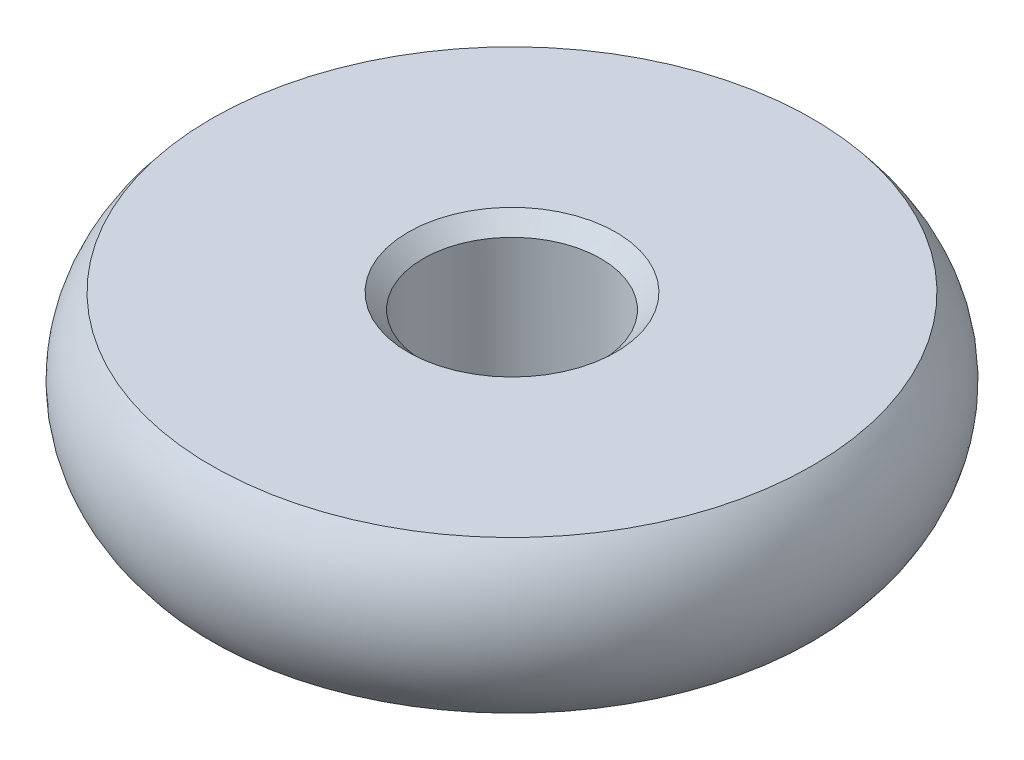
ISO-10303-21;
HEADER;
FILE_DESCRIPTION(('STEP AP214'),'2;1');
FILE_NAME('part.step','',(''),(''),'','','');
FILE_SCHEMA(('AUTOMOTIVE_DESIGN { 1 0 10303 214 1 1 1 1 }'));
ENDSEC;
DATA;
#1=APPLICATION_CONTEXT('core data for automotive mechanical design processes');
#2=APPLICATION_PROTOCOL_DEFINITION('international standard','automotive_design',2000,#1);
#3=PRODUCT_CONTEXT('',#1,'mechanical');
#4=PRODUCT('Part','Part','',(#3));
#5=PRODUCT_RELATED_PRODUCT_CATEGORY('part','',(#4));
#6=PRODUCT_DEFINITION_FORMATION('','',#4);
#7=PRODUCT_DEFINITION_CONTEXT('part definition',#1,'design');
#8=PRODUCT_DEFINITION('design','',#6,#7);
#9=PRODUCT_DEFINITION_SHAPE('','',#8);
#10=(LENGTH_UNIT() NAMED_UNIT(*) SI_UNIT(.MILLI.,.METRE.));
#11=(NAMED_UNIT(*) PLANE_ANGLE_UNIT() SI_UNIT($,.RADIAN.));
#12=(NAMED_UNIT(*) SI_UNIT($,.STERADIAN.) SOLID_ANGLE_UNIT());
#13=UNCERTAINTY_MEASURE_WITH_UNIT(LENGTH_MEASURE(1.E-05),#10,'distance_accuracy_value','');
#14=(GEOMETRIC_REPRESENTATION_CONTEXT(3) GLOBAL_UNCERTAINTY_ASSIGNED_CONTEXT((#13)) GLOBAL_UNIT_ASSIGNED_CONTEXT((#10,
#11,#12)) REPRESENTATION_CONTEXT('',''));
#15=CARTESIAN_POINT('',(0.,0.,0.));
#16=DIRECTION('',(0.,0.,1.));
#17=DIRECTION('',(1.,0.,0.));
#18=AXIS2_PLACEMENT_3D('',#15,#16,#17);
#19=CARTESIAN_POINT('',(3.43024899888577E-12,-1000.,0.));
#20=DIRECTION('',(0.,-1.,0.));
#21=DIRECTION('',(1.,0.,0.));
#22=AXIS2_PLACEMENT_3D('',#19,#20,#21);
#23=CYLINDRICAL_SURFACE('',#22,17.5);
#24=CARTESIAN_POINT('',(0.,12.,0.));
#25=DIRECTION('',(0.,1.,0.));
#26=DIRECTION('',(-1.,0.,0.));
#27=AXIS2_PLACEMENT_3D('',#24,#25,#26);
#28=CIRCLE('',#27,17.5);
#29=CARTESIAN_POINT('',(-17.5,12.,0.));
#30=VERTEX_POINT('',#29);
#31=EDGE_CURVE('E40',#30,#30,#28,.T.);
#32=ORIENTED_EDGE('',*,*,#31,.T.);
#33=EDGE_LOOP('',(#32));
#34=FACE_BOUND('',#33,.T.);
#35=CARTESIAN_POINT('',(0.,-12.0000000000001,0.));
#36=DIRECTION('',(0.,-1.,0.));
#37=DIRECTION('',(1.,0.,0.));
#38=AXIS2_PLACEMENT_3D('',#35,#36,#37);
#39=CIRCLE('',#38,17.5);
#40=CARTESIAN_POINT('',(17.5,-12.0000000000001,0.));
#41=VERTEX_POINT('',#40);
#42=EDGE_CURVE('E44',#41,#41,#39,.T.);
#43=ORIENTED_EDGE('',*,*,#42,.T.);
#44=EDGE_LOOP('',(#43));
#45=FACE_BOUND('',#44,.T.);
#46=ADVANCED_FACE('F32',(#34,#45),#23,.F.);
#47=CARTESIAN_POINT('',(17.5,-15.0000000000001,0.));
#48=DIRECTION('',(0.,-1.,0.));
#49=DIRECTION('',(1.,0.,0.));
#50=AXIS2_PLACEMENT_3D('',#47,#48,#49);
#51=PLANE('',#50);
#52=CARTESIAN_POINT('',(0.,-15.0000000000001,0.));
#53=DIRECTION('',(0.,-1.,0.));
#54=DIRECTION('',(1.,0.,0.));
#55=AXIS2_PLACEMENT_3D('',#52,#53,#54);
#56=CIRCLE('',#55,20.4999999999999);
#57=CARTESIAN_POINT('',(20.5,-15.0000000000001,0.));
#58=VERTEX_POINT('',#57);
#59=EDGE_CURVE('E10',#58,#58,#56,.F.);
#60=ORIENTED_EDGE('',*,*,#59,.T.);
#61=EDGE_LOOP('',(#60));
#62=FACE_BOUND('',#61,.T.);
#63=CARTESIAN_POINT('',(0.,-15.0000000000002,0.));
#64=DIRECTION('',(0.,-1.,0.));
#65=DIRECTION('',(1.,0.,0.));
#66=AXIS2_PLACEMENT_3D('',#63,#64,#65);
#67=CIRCLE('',#66,59.2705098312484);
#68=CARTESIAN_POINT('',(59.2705098312484,-15.,0.));
#69=VERTEX_POINT('',#68);
#70=EDGE_CURVE('E53',#69,#69,#67,.T.);
#71=ORIENTED_EDGE('',*,*,#70,.T.);
#72=EDGE_LOOP('',(#71));
#73=FACE_BOUND('',#72,.T.);
#74=ADVANCED_FACE('F73',(#62,#73),#51,.T.);
#75=CARTESIAN_POINT('',(0.,-1.13628604832136E-13,0.));
#76=DIRECTION('',(0.,-1.,0.));
#77=DIRECTION('',(1.,0.,0.));
#78=AXIS2_PLACEMENT_3D('',#75,#76,#77);
#79=TOROIDAL_SURFACE('',#78,42.5,22.5);
#80=CARTESIAN_POINT('',(0.,14.9999999999997,0.));
#81=DIRECTION('',(0.,-1.,0.));
#82=DIRECTION('',(1.,0.,0.));
#83=AXIS2_PLACEMENT_3D('',#80,#81,#82);
#84=CIRCLE('',#83,59.2705098312485);
#85=CARTESIAN_POINT('',(59.2705098312484,14.9999999999999,0.));
#86=VERTEX_POINT('',#85);
#87=EDGE_CURVE('E56',#86,#86,#84,.T.);
#88=ORIENTED_EDGE('',*,*,#87,.T.);
#89=EDGE_LOOP('',(#88));
#90=FACE_BOUND('',#89,.T.);
#91=ORIENTED_EDGE('',*,*,#70,.F.);
#92=EDGE_LOOP('',(#91));
#93=FACE_BOUND('',#92,.T.);
#94=ADVANCED_FACE('F60',(#90,#93),#79,.T.);
#95=CARTESIAN_POINT('',(17.5,14.9999999999999,0.));
#96=DIRECTION('',(0.,1.,0.));
#97=DIRECTION('',(-1.,0.,0.));
#98=AXIS2_PLACEMENT_3D('',#95,#96,#97);
#99=PLANE('',#98);
#100=CARTESIAN_POINT('',(0.,14.9999999999999,0.));
#101=DIRECTION('',(0.,1.,0.));
#102=DIRECTION('',(-1.,0.,0.));
#103=AXIS2_PLACEMENT_3D('',#100,#101,#102);
#104=CIRCLE('',#103,20.4999999999999);
#105=CARTESIAN_POINT('',(-20.4999999999999,14.9999999999998,0.));
#106=VERTEX_POINT('',#105);
#107=EDGE_CURVE('E48',#106,#106,#104,.F.);
#108=ORIENTED_EDGE('',*,*,#107,.T.);
#109=EDGE_LOOP('',(#108));
#110=FACE_BOUND('',#109,.T.);
#111=ORIENTED_EDGE('',*,*,#87,.F.);
#112=EDGE_LOOP('',(#111));
#113=FACE_BOUND('',#112,.T.);
#114=ADVANCED_FACE('F63',(#110,#113),#99,.T.);
#115=CARTESIAN_POINT('',(0.,14.9999999999999,0.));
#116=DIRECTION('',(0.,1.,0.));
#117=DIRECTION('',(-1.,0.,0.));
#118=AXIS2_PLACEMENT_3D('',#115,#116,#117);
#119=CONICAL_SURFACE('',#118,20.4999999999999,0.785398163397451);
#120=ORIENTED_EDGE('',*,*,#31,.F.);
#121=EDGE_LOOP('',(#120));
#122=FACE_BOUND('',#121,.T.);
#123=ORIENTED_EDGE('',*,*,#107,.F.);
#124=EDGE_LOOP('',(#123));
#125=FACE_BOUND('',#124,.T.);
#126=ADVANCED_FACE('F65',(#122,#125),#119,.F.);
#127=CARTESIAN_POINT('',(0.,-12.0000000000001,0.));
#128=DIRECTION('',(0.,-1.,0.));
#129=DIRECTION('',(1.,0.,0.));
#130=AXIS2_PLACEMENT_3D('',#127,#128,#129);
#131=CONICAL_SURFACE('',#130,17.5,0.785398163397435);
#132=ORIENTED_EDGE('',*,*,#59,.F.);
#133=EDGE_LOOP('',(#132));
#134=FACE_BOUND('',#133,.T.);
#135=ORIENTED_EDGE('',*,*,#42,.F.);
#136=EDGE_LOOP('',(#135));
#137=FACE_BOUND('',#136,.T.);
#138=ADVANCED_FACE('F35',(#134,#137),#131,.F.);
#139=CLOSED_SHELL('',(#46,#74,#94,#114,#126,#138));
#140=MANIFOLD_SOLID_BREP('B2',#139);
#141=ADVANCED_BREP_SHAPE_REPRESENTATION('',(#18,#140),#14);
#142=SHAPE_DEFINITION_REPRESENTATION(#9,#141);
ENDSEC;
END-ISO-10303-21;
